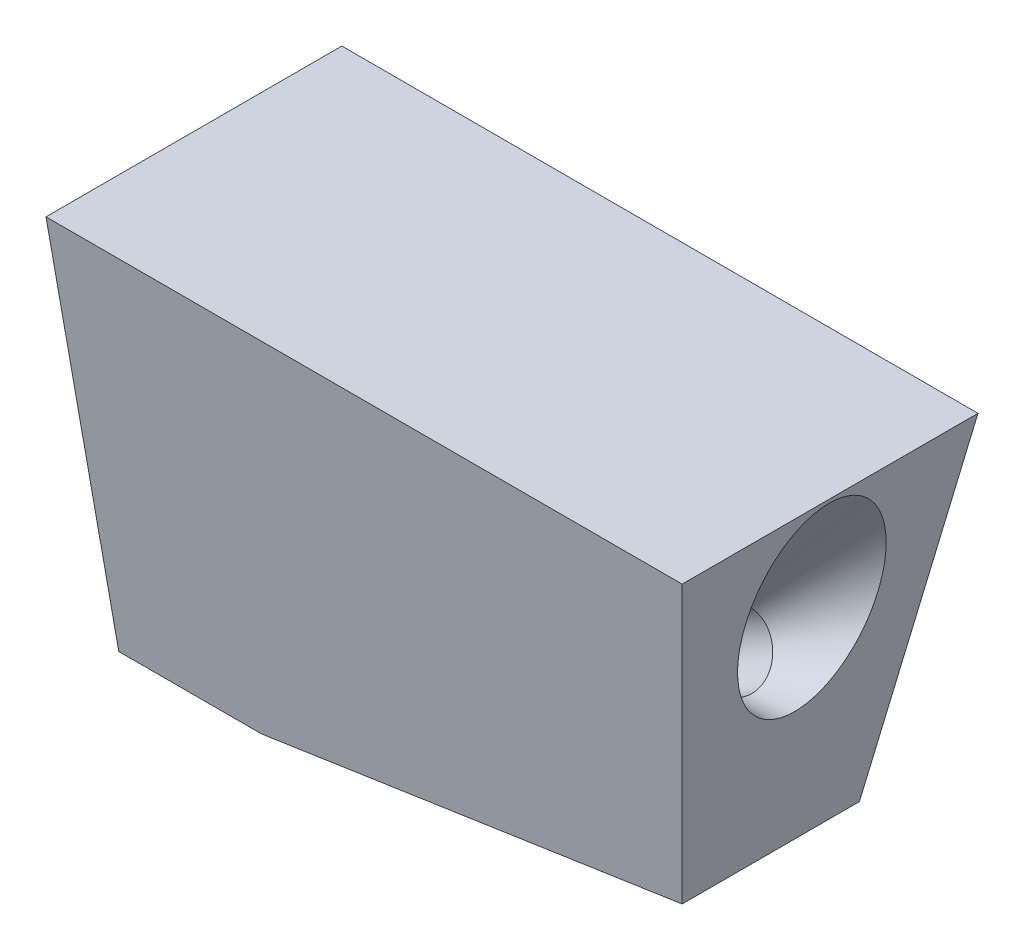
ISO-10303-21;
HEADER;
FILE_DESCRIPTION(('STEP AP214'),'2;1');
FILE_NAME('part.step','',(''),(''),'','','');
FILE_SCHEMA(('AUTOMOTIVE_DESIGN { 1 0 10303 214 1 1 1 1 }'));
ENDSEC;
DATA;
#1=APPLICATION_CONTEXT('core data for automotive mechanical design processes');
#2=APPLICATION_PROTOCOL_DEFINITION('international standard','automotive_design',2000,#1);
#3=PRODUCT_CONTEXT('',#1,'mechanical');
#4=PRODUCT('Part','Part','',(#3));
#5=PRODUCT_RELATED_PRODUCT_CATEGORY('part','',(#4));
#6=PRODUCT_DEFINITION_FORMATION('','',#4);
#7=PRODUCT_DEFINITION_CONTEXT('part definition',#1,'design');
#8=PRODUCT_DEFINITION('design','',#6,#7);
#9=PRODUCT_DEFINITION_SHAPE('','',#8);
#10=(LENGTH_UNIT() NAMED_UNIT(*) SI_UNIT(.MILLI.,.METRE.));
#11=(NAMED_UNIT(*) PLANE_ANGLE_UNIT() SI_UNIT($,.RADIAN.));
#12=(NAMED_UNIT(*) SI_UNIT($,.STERADIAN.) SOLID_ANGLE_UNIT());
#13=UNCERTAINTY_MEASURE_WITH_UNIT(LENGTH_MEASURE(1.E-05),#10,'distance_accuracy_value','');
#14=(GEOMETRIC_REPRESENTATION_CONTEXT(3) GLOBAL_UNCERTAINTY_ASSIGNED_CONTEXT((#13)) GLOBAL_UNIT_ASSIGNED_CONTEXT((#10,
#11,#12)) REPRESENTATION_CONTEXT('',''));
#15=CARTESIAN_POINT('',(0.,0.,0.));
#16=DIRECTION('',(0.,0.,1.));
#17=DIRECTION('',(1.,0.,0.));
#18=AXIS2_PLACEMENT_3D('',#15,#16,#17);
#19=CARTESIAN_POINT('',(-0.37592,0.,-0.697645113220181));
#20=DIRECTION('',(-1.,0.,0.));
#21=DIRECTION('',(0.,0.,1.));
#22=AXIS2_PLACEMENT_3D('',#19,#20,#21);
#23=PLANE('',#22);
#24=DIRECTION('',(0.,-0.984807753012208,-0.173648177666931));
#25=VECTOR('',#24,1.);
#26=CARTESIAN_POINT('',(-0.37592,-0.127991652447482,0.0282316183680482));
#27=LINE('',#26,#25);
#28=CARTESIAN_POINT('',(-0.37592,0.27922650273224,0.10003516616056));
#29=VERTEX_POINT('',#28);
#30=CARTESIAN_POINT('',(-0.375920000000002,0.,0.0508));
#31=VERTEX_POINT('',#30);
#32=EDGE_CURVE('E435',#29,#31,#27,.T.);
#33=ORIENTED_EDGE('',*,*,#32,.F.);
#34=DIRECTION('',(0.,0.,-1.));
#35=VECTOR('',#34,1.);
#36=CARTESIAN_POINT('',(-0.37592,0.27922650273224,-0.697645113220181));
#37=LINE('',#36,#35);
#38=CARTESIAN_POINT('',(-0.37592,0.27922650273224,-0.10003516616056));
#39=VERTEX_POINT('',#38);
#40=EDGE_CURVE('E61',#29,#39,#37,.T.);
#41=ORIENTED_EDGE('',*,*,#40,.T.);
#42=DIRECTION('',(0.,0.984807753012208,-0.173648177666931));
#43=VECTOR('',#42,1.);
#44=CARTESIAN_POINT('',(-0.37592,0.110617029166538,-0.0703047667678759));
#45=LINE('',#44,#43);
#46=CARTESIAN_POINT('',(-0.37592,0.,-0.0508));
#47=VERTEX_POINT('',#46);
#48=EDGE_CURVE('E169',#47,#39,#45,.T.);
#49=ORIENTED_EDGE('',*,*,#48,.F.);
#50=DIRECTION('',(0.,0.,1.));
#51=VECTOR('',#50,1.);
#52=CARTESIAN_POINT('',(-0.37592,0.,-0.697645113220181));
#53=LINE('',#52,#51);
#54=CARTESIAN_POINT('',(-0.375920000000002,0.,-0.024301429259202));
#55=VERTEX_POINT('',#54);
#56=EDGE_CURVE('E430',#47,#55,#53,.T.);
#57=ORIENTED_EDGE('',*,*,#56,.T.);
#58=CARTESIAN_POINT('',(-0.375920000000002,-0.075596242,0.));
#59=DIRECTION('',(-1.,0.,0.));
#60=DIRECTION('',(0.,0.,1.));
#61=AXIS2_PLACEMENT_3D('',#58,#59,#60);
#62=CIRCLE('',#61,0.079406242);
#63=CARTESIAN_POINT('',(-0.375920000000002,0.,0.024301429259202));
#64=VERTEX_POINT('',#63);
#65=EDGE_CURVE('E186',#55,#64,#62,.F.);
#66=ORIENTED_EDGE('',*,*,#65,.T.);
#67=EDGE_CURVE('E429',#64,#31,#53,.T.);
#68=ORIENTED_EDGE('',*,*,#67,.T.);
#69=EDGE_LOOP('',(#33,#41,#49,#57,#66,#68));
#70=FACE_BOUND('',#69,.T.);
#71=ADVANCED_FACE('F45',(#70),#23,.T.);
#72=CARTESIAN_POINT('',(38.0505893023531,0.,-0.0508));
#73=DIRECTION('',(0.,0.173648177666931,0.984807753012208));
#74=DIRECTION('',(0.,-0.984807753012208,0.173648177666931));
#75=AXIS2_PLACEMENT_3D('',#72,#73,#74);
#76=PLANE('',#75);
#77=DIRECTION('',(-1.,0.,0.));
#78=VECTOR('',#77,1.);
#79=CARTESIAN_POINT('',(38.0505893023531,0.27922650273224,-0.10003516616056));
#80=LINE('',#79,#78);
#81=CARTESIAN_POINT('',(0.0543151661605589,0.279226502732241,-0.100035166160561));
#82=VERTEX_POINT('',#81);
#83=EDGE_CURVE('E167',#82,#39,#80,.T.);
#84=ORIENTED_EDGE('',*,*,#83,.F.);
#85=DIRECTION('',(-0.171087869746036,-0.970287525247814,0.171087869746036));
#86=VECTOR('',#85,1.);
#87=CARTESIAN_POINT('',(1.11871235410314,6.31572292356323,-1.16443235410315));
#88=LINE('',#87,#86);
#89=CARTESIAN_POINT('',(0.0142086463569854,0.0517711261220263,-0.0599286463569818));
#90=VERTEX_POINT('',#89);
#91=EDGE_CURVE('E154',#82,#90,#88,.T.);
#92=ORIENTED_EDGE('',*,*,#91,.T.);
#93=DIRECTION('',(-0.984346441568213,-0.173566836012845,0.0306045161452665));
#94=VECTOR('',#93,1.);
#95=CARTESIAN_POINT('',(36.8599799943277,6.54867473978421,-1.20550804450795));
#96=LINE('',#95,#94);
#97=CARTESIAN_POINT('',(-0.279399999999989,0.,-0.0508000000000054));
#98=VERTEX_POINT('',#97);
#99=EDGE_CURVE('E164',#90,#98,#96,.T.);
#100=ORIENTED_EDGE('',*,*,#99,.T.);
#101=DIRECTION('',(-1.,0.,0.));
#102=VECTOR('',#101,1.);
#103=CARTESIAN_POINT('',(38.0505893023531,0.,-0.0508));
#104=LINE('',#103,#102);
#105=EDGE_CURVE('E163',#98,#47,#104,.T.);
#106=ORIENTED_EDGE('',*,*,#105,.T.);
#107=ORIENTED_EDGE('',*,*,#48,.T.);
#108=EDGE_LOOP('',(#84,#92,#100,#106,#107));
#109=FACE_BOUND('',#108,.T.);
#110=ADVANCED_FACE('F168',(#109),#76,.F.);
#111=CARTESIAN_POINT('',(38.0505893023531,0.,0.0508));
#112=DIRECTION('',(0.,0.173648177666931,-0.984807753012208));
#113=DIRECTION('',(0.,0.984807753012208,0.173648177666931));
#114=AXIS2_PLACEMENT_3D('',#111,#112,#113);
#115=PLANE('',#114);
#116=DIRECTION('',(1.,0.,0.));
#117=VECTOR('',#116,1.);
#118=CARTESIAN_POINT('',(38.0505893023531,0.27922650273224,0.10003516616056));
#119=LINE('',#118,#117);
#120=CARTESIAN_POINT('',(0.0543151661605588,0.279226502732241,0.100035166160561));
#121=VERTEX_POINT('',#120);
#122=EDGE_CURVE('E69',#29,#121,#119,.T.);
#123=ORIENTED_EDGE('',*,*,#122,.F.);
#124=ORIENTED_EDGE('',*,*,#32,.T.);
#125=DIRECTION('',(-1.,0.,0.));
#126=VECTOR('',#125,1.);
#127=CARTESIAN_POINT('',(38.0505893023531,0.,0.0508));
#128=LINE('',#127,#126);
#129=CARTESIAN_POINT('',(-0.279399999999989,0.,0.0507999999999916));
#130=VERTEX_POINT('',#129);
#131=EDGE_CURVE('E426',#130,#31,#128,.T.);
#132=ORIENTED_EDGE('',*,*,#131,.F.);
#133=DIRECTION('',(0.984346441568213,0.173566836012845,0.0306045161452664));
#134=VECTOR('',#133,1.);
#135=CARTESIAN_POINT('',(36.8599799943277,6.54867473978421,1.20550804450795));
#136=LINE('',#135,#134);
#137=CARTESIAN_POINT('',(0.0142086463569766,0.0517711261220234,0.0599286463569735));
#138=VERTEX_POINT('',#137);
#139=EDGE_CURVE('E411',#130,#138,#136,.T.);
#140=ORIENTED_EDGE('',*,*,#139,.T.);
#141=DIRECTION('',(0.171087869746036,0.970287525247814,0.171087869746036));
#142=VECTOR('',#141,1.);
#143=CARTESIAN_POINT('',(1.11871235410314,6.31572292356323,1.16443235410315));
#144=LINE('',#143,#142);
#145=EDGE_CURVE('E438',#138,#121,#144,.T.);
#146=ORIENTED_EDGE('',*,*,#145,.T.);
#147=EDGE_LOOP('',(#123,#124,#132,#140,#146));
#148=FACE_BOUND('',#147,.T.);
#149=ADVANCED_FACE('F341',(#148),#115,.F.);
#150=CARTESIAN_POINT('',(0.0142086463569735,0.0517711261220249,37.6441893023531));
#151=DIRECTION('',(-0.984807753012208,0.173648177666931,0.));
#152=DIRECTION('',(-0.173648177666931,-0.984807753012208,0.));
#153=AXIS2_PLACEMENT_3D('',#150,#151,#152);
#154=PLANE('',#153);
#155=CARTESIAN_POINT('',(0.042002425469776,0.209397480302932,0.));
#156=DIRECTION('',(-0.984807753012208,0.173648177666931,0.));
#157=DIRECTION('',(0.173648177666931,0.984807753012208,0.));
#158=AXIS2_PLACEMENT_3D('',#155,#156,#157);
#159=ELLIPSE('',#158,0.0679896082823363,0.0488359616240532);
#160=CARTESIAN_POINT('',(0.0538086970482922,0.27635417366364,0.));
#161=VERTEX_POINT('',#160);
#162=EDGE_CURVE('E324',#161,#161,#159,.F.);
#163=ORIENTED_EDGE('',*,*,#162,.F.);
#164=EDGE_LOOP('',(#163));
#165=FACE_BOUND('',#164,.T.);
#166=DIRECTION('',(0.,0.,-1.));
#167=VECTOR('',#166,1.);
#168=CARTESIAN_POINT('',(0.0543151661605597,0.27922650273224,37.6441893023531));
#169=LINE('',#168,#167);
#170=EDGE_CURVE('E12',#121,#82,#169,.T.);
#171=ORIENTED_EDGE('',*,*,#170,.F.);
#172=ORIENTED_EDGE('',*,*,#145,.F.);
#173=DIRECTION('',(0.,0.,-1.));
#174=VECTOR('',#173,1.);
#175=CARTESIAN_POINT('',(0.0142086463569735,0.0517711261220249,37.6441893023531));
#176=LINE('',#175,#174);
#177=EDGE_CURVE('E158',#138,#90,#176,.T.);
#178=ORIENTED_EDGE('',*,*,#177,.T.);
#179=ORIENTED_EDGE('',*,*,#91,.F.);
#180=EDGE_LOOP('',(#171,#172,#178,#179));
#181=FACE_BOUND('',#180,.T.);
#182=ADVANCED_FACE('F156',(#165,#181),#154,.F.);
#183=CARTESIAN_POINT('',(0.,0.,0.));
#184=DIRECTION('',(0.,1.,0.));
#185=DIRECTION('',(0.,0.,1.));
#186=AXIS2_PLACEMENT_3D('',#183,#184,#185);
#187=PLANE('',#186);
#188=DIRECTION('',(-1.,0.,0.));
#189=VECTOR('',#188,1.);
#190=CARTESIAN_POINT('',(37.9299393023531,0.,0.024301429259202));
#191=LINE('',#190,#189);
#192=CARTESIAN_POINT('',(-0.302505698926175,0.,0.024301429259202));
#193=VERTEX_POINT('',#192);
#194=EDGE_CURVE('E183',#193,#64,#191,.T.);
#195=ORIENTED_EDGE('',*,*,#194,.F.);
#196=CARTESIAN_POINT('',(-0.227825197505043,0.000821082384313734,0.0215810982692062));
#197=CARTESIAN_POINT('',(-0.245034827655447,0.00574587858713153,0.00414270174912001));
#198=CARTESIAN_POINT('',(-0.241524302840157,0.0282854026772107,0.0143490100953686));
#199=CARTESIAN_POINT('',(-0.232761897231027,-0.000191267152315804,0.0250702187356864));
#200=CARTESIAN_POINT('',(-0.245650855646434,0.00566777320241242,0.00770700976054411));
#201=CARTESIAN_POINT('',(-0.244977713848214,0.026157616484449,0.0166688839114718));
#202=CARTESIAN_POINT('',(-0.238431185756585,-0.00123806953368211,0.027930289615228));
#203=CARTESIAN_POINT('',(-0.248388192218129,0.00497262893043278,0.0115103437863978));
#204=CARTESIAN_POINT('',(-0.248913969918457,0.0238423713748454,0.0185705102982331));
#205=CARTESIAN_POINT('',(-0.250793194721189,-0.00297707742583745,0.0322289362925408));
#206=CARTESIAN_POINT('',(-0.255892273738704,0.00341525099514985,0.0177455655134612));
#207=CARTESIAN_POINT('',(-0.257357955889735,0.0193962809886868,0.0214286282586706));
#208=CARTESIAN_POINT('',(-0.257506274585809,-0.00366066852221202,0.0336336714025015));
#209=CARTESIAN_POINT('',(-0.260633657709613,0.00254190370459321,0.0203534609740121));
#210=CARTESIAN_POINT('',(-0.261876654974955,0.0172708330905814,0.0223626195700815));
#211=CARTESIAN_POINT('',(-0.269799835115366,-0.00410994322563168,0.0345696750414885));
#212=CARTESIAN_POINT('',(-0.269751315759274,0.00149116630553639,0.0230126072141926));
#213=CARTESIAN_POINT('',(-0.269946288127882,0.0142679037069781,0.0229849570200847));
#214=CARTESIAN_POINT('',(-0.275323446491675,-0.00403774105700813,0.0344314054213974));
#215=CARTESIAN_POINT('',(-0.274027420527515,0.00118322418916697,0.0235670913464913));
#216=CARTESIAN_POINT('',(-0.273501911955909,0.0132223642176632,0.0228930232292358));
#217=CARTESIAN_POINT('',(-0.286011306031935,-0.00322845548345473,0.0327000352877498));
#218=CARTESIAN_POINT('',(-0.282179914978438,0.00109125813693063,0.0231161412096964));
#219=CARTESIAN_POINT('',(-0.280210477091128,0.0119412986892854,0.0217418562581842));
#220=CARTESIAN_POINT('',(-0.291173148744714,-0.00248730685306159,0.0310980388902579));
#221=CARTESIAN_POINT('',(-0.286149097631656,0.00129894419664579,0.0221276357619358));
#222=CARTESIAN_POINT('',(-0.283360821575895,0.0117107676757025,0.0206767083128105));
#223=CARTESIAN_POINT('',(-0.299602822393734,-0.000801539704433188,0.0267477659134277));
#224=CARTESIAN_POINT('',(-0.292408755866523,0.00191881633869061,0.0190819593298142));
#225=CARTESIAN_POINT('',(-0.288383902424835,0.0118611241504694,0.0177842646529243));
#226=CARTESIAN_POINT('',(-0.303030538955303,0.000103444682686011,0.0241781701007463));
#227=CARTESIAN_POINT('',(-0.294889447090707,0.0023037022246217,0.0171668741087767));
#228=CARTESIAN_POINT('',(-0.290370237180289,0.0121655112151282,0.0160757716097415));
#229=CARTESIAN_POINT('',(-0.308514392850169,0.00172652459697053,0.0183135948687384));
#230=CARTESIAN_POINT('',(-0.298746447297998,0.00298044372071625,0.012879858933677));
#231=CARTESIAN_POINT('',(-0.293503241996811,0.0128466727594801,0.0121764867744927));
#232=CARTESIAN_POINT('',(-0.310606869220775,0.00244921520093865,0.0150414006438955));
#233=CARTESIAN_POINT('',(-0.300152350128904,0.00327523254656574,0.0105128092522198));
#234=CARTESIAN_POINT('',(-0.294672249601443,0.0132211344266295,0.010000844581469));
#235=CARTESIAN_POINT('',(-0.312967619974572,0.00329568497416077,0.00931742185770279));
#236=CARTESIAN_POINT('',(-0.301716686246427,0.00361214202736292,0.00646467066227568));
#237=CARTESIAN_POINT('',(-0.295983169510553,0.013678095082922,0.0061950406152292));
#238=CARTESIAN_POINT('',(-0.313617084874504,0.00354030598861865,0.00697552549228586));
#239=CARTESIAN_POINT('',(-0.302136666185862,0.00370603321499294,0.00483113633064015));
#240=CARTESIAN_POINT('',(-0.29634080920666,0.0138168290783898,0.00463794216868613));
#241=CARTESIAN_POINT('',(-0.314563628458891,0.00389545139863984,0.000787930489150023));
#242=CARTESIAN_POINT('',(-0.302752910089274,0.00384367854693773,0.000535544065680751));
#243=CARTESIAN_POINT('',(-0.296862391385962,0.0140175043608145,0.000523885411308966));
#244=CARTESIAN_POINT('',(-0.314417113795285,0.00383807612208008,-0.00311886327876337));
#245=CARTESIAN_POINT('',(-0.302660770954939,0.00382288355677158,-0.00213939502445816));
#246=CARTESIAN_POINT('',(-0.296782271000047,0.013983779546503,-0.0020736943094739));
#247=CARTESIAN_POINT('',(-0.312657905792592,0.00318275039907247,-0.0106634982811221));
#248=CARTESIAN_POINT('',(-0.301511531396563,0.00356664435177186,-0.00740601427595318));
#249=CARTESIAN_POINT('',(-0.295811667919384,0.0136160577081122,-0.007090030478481));
#250=CARTESIAN_POINT('',(-0.311045007020005,0.0025847242100467,-0.0143013017540773));
#251=CARTESIAN_POINT('',(-0.300461562154091,0.00333278827930966,-0.00998164829714308));
#252=CARTESIAN_POINT('',(-0.294921071680773,0.0132820186114908,-0.00950876181954922));
#253=CARTESIAN_POINT('',(-0.306440159650584,0.00108938252153803,-0.020880290888427));
#254=CARTESIAN_POINT('',(-0.29729910359028,0.00271570653149375,-0.0147410667047117));
#255=CARTESIAN_POINT('',(-0.292324145606441,0.0125632939646946,-0.0138830517805381));
#256=CARTESIAN_POINT('',(-0.30345573705115,0.000193707650167118,-0.0238251473132877));
#257=CARTESIAN_POINT('',(-0.295199673901025,0.00233432378586256,-0.0169294269223584));
#258=CARTESIAN_POINT('',(-0.290622265671655,0.0121788928930591,-0.0158410510464991));
#259=CARTESIAN_POINT('',(-0.296432365420741,-0.00148605921301844,-0.028628143513798));
#260=CARTESIAN_POINT('',(-0.290078907132247,0.00166019233881121,-0.0204132760605369));
#261=CARTESIAN_POINT('',(-0.286507609386632,0.0117486224899564,-0.0190345048786184));
#262=CARTESIAN_POINT('',(-0.292421815697956,-0.00227239044141986,-0.0305117439313388));
#263=CARTESIAN_POINT('',(-0.287063238453745,0.00136248817850754,-0.0217461800460033));
#264=CARTESIAN_POINT('',(-0.284113782114589,0.0116944848100444,-0.0202868879163018));
#265=CARTESIAN_POINT('',(-0.283849340075187,-0.00342900818647396,-0.0331572963874476));
#266=CARTESIAN_POINT('',(-0.280569772361123,0.0010856610224745,-0.0233043318321131));
#267=CARTESIAN_POINT('',(-0.278862882478683,0.0121596022092071,-0.0220458836090603));
#268=CARTESIAN_POINT('',(-0.279295190972908,-0.00380452880153439,-0.0339333987496222));
#269=CARTESIAN_POINT('',(-0.277047639383919,0.00110327745740793,-0.023545154910523));
#270=CARTESIAN_POINT('',(-0.276012181647064,0.0126714724574782,-0.0225619046424186));
#271=CARTESIAN_POINT('',(-0.269701463152515,-0.00410629730163296,-0.0345630378480585));
#272=CARTESIAN_POINT('',(-0.269746394801657,0.00148426748942568,-0.0229936986933425));
#273=CARTESIAN_POINT('',(-0.269881702633036,0.0142919892466934,-0.0229805440307946));
#274=CARTESIAN_POINT('',(-0.264653504068372,-0.00399168402953402,-0.0343326317027686));
#275=CARTESIAN_POINT('',(-0.2659129984888,0.00189006473089505,-0.0220765629153878));
#276=CARTESIAN_POINT('',(-0.266586044859265,0.0154476236056216,-0.0228273497835158));
#277=CARTESIAN_POINT('',(-0.253793893841115,-0.00329673403971204,-0.0328464784638622));
#278=CARTESIAN_POINT('',(-0.25804777168414,0.00299938327773119,-0.0189984846186303));
#279=CARTESIAN_POINT('',(-0.259381389799495,0.0184306001459407,-0.0218392245471482));
#280=CARTESIAN_POINT('',(-0.248036924026835,-0.00262603076696128,-0.0313908642611835));
#281=CARTESIAN_POINT('',(-0.25412124898949,0.00376990506999124,-0.0165248798583642));
#282=CARTESIAN_POINT('',(-0.255484648351846,0.0203469392501991,-0.0208714043450132));
#283=CARTESIAN_POINT('',(-0.239413210970669,-0.00134157330358348,-0.028165632697237));
#284=CARTESIAN_POINT('',(-0.249253851903819,0.00480639473717398,-0.0119576174475555));
#285=CARTESIAN_POINT('',(-0.24957588621242,0.0235275660937497,-0.0187269870547679));
#286=CARTESIAN_POINT('',(-0.236308205853108,-0.000811429626366428,-0.0267516692029636));
#287=CARTESIAN_POINT('',(-0.24771983337294,0.0051601389311344,-0.0100184273300864));
#288=CARTESIAN_POINT('',(-0.247431093294174,0.0247477519269788,-0.0177868599027238));
#289=CARTESIAN_POINT('',(-0.230477145019733,0.000272654770886545,-0.0234963613029371));
#290=CARTESIAN_POINT('',(-0.245473970538167,0.00567015630017144,-0.00606795690835905));
#291=CARTESIAN_POINT('',(-0.243380619980735,0.0271372754227797,-0.0156224452219534));
#292=CARTESIAN_POINT('',(-0.227751727404986,0.000826633560826962,-0.0216543108103016));
#293=CARTESIAN_POINT('',(-0.244812549085203,0.00581424778672661,-0.00404223108031309));
#294=CARTESIAN_POINT('',(-0.241475342731792,0.0283065252460894,-0.0143976882246357));
#295=CARTESIAN_POINT('',(-0.225275643428538,0.00135586198968455,-0.0195888989002276));
#296=CARTESIAN_POINT('',(-0.244757355961534,0.00576877420614223,-0.00225342325622203));
#297=CARTESIAN_POINT('',(-0.239737733013406,0.0293975411594971,-0.0130244209340158));
#298=(BOUNDED_SURFACE() B_SPLINE_SURFACE(3,2,((#196,#197,#198),(#199,#200,#201),(#202,#203,
#204),(#205,#206,#207),(#208,#209,#210),(#211,#212,#213),(#214,#215,#216),(#217,#218,#219),
(#220,#221,#222),(#223,#224,#225),(#226,#227,#228),(#229,#230,#231),(#232,#233,#234),(#235,#236,
#237),(#238,#239,#240),(#241,#242,#243),(#244,#245,#246),(#247,#248,#249),(#250,#251,#252),
(#253,#254,#255),(#256,#257,#258),(#259,#260,#261),(#262,#263,#264),(#265,#266,#267),(#268,#269,
#270),(#271,#272,#273),(#274,#275,#276),(#277,#278,#279),(#280,#281,#282),(#283,#284,#285),
(#286,#287,#288),(#289,#290,#291),(#292,#293,#294),(#295,#296,#297)),.UNSPECIFIED.,.F.,.F.,
.F.) B_SPLINE_SURFACE_WITH_KNOTS((4,2,2,2,2,2,2,2,2,2,2,2,2,2,2,2,4),(3,3),(0.,
0.0201539584671881,0.0407666975654291,0.0570670854146052,0.0734672035679023,0.0877081664327257,
0.101542859946109,0.110571495241634,0.125004171594238,0.139438870208372,0.153795289694016,
0.167790761380671,0.181605763093261,0.19659395858546,0.214644351189683,0.225509394554146,
0.236392487536961),(0.,1.),
.UNSPECIFIED.) GEOMETRIC_REPRESENTATION_ITEM() RATIONAL_B_SPLINE_SURFACE(((1.,0.630877932053694,
1.),(1.,0.672074069199554,1.),(1.,0.710262779390349,1.),(1.,0.777863435183107,1.),(1.,
0.807055799266452,1.),(1.,0.847025625113269,1.),(1.,0.860377941141275,1.),(1.,0.877904377756496,
1.),(1.,0.882021843771012,1.),(1.,0.883303214852003,1.),(1.,0.881311221974648,1.),(1.,
0.876025044633842,1.),(1.,0.872769630583407,1.),(1.,0.868698546182562,1.),(1.,0.867428195714935,
1.),(1.,0.86559550462401,1.),(1.,0.865912049725688,1.),(1.,0.869253613703966,1.),(1.,
0.872279012077236,1.),(1.,0.878303632729241,1.),(1.,0.881302907987323,1.),(1.,0.883414326053349,
1.),(1.,0.88262230290473,1.),(1.,0.874779530792039,1.),(1.,0.867809619062972,1.),(1.,
0.846482034914803,1.),(1.,0.831547246020609,1.),(1.,0.791082953057688,1.),(1.,0.764012271614353,
1.),(1.,0.714444681703178,1.),(1.,0.694416731867675,1.),(1.,0.652735964736715,1.),(1.,
0.631080503393025,1.),(1.,0.60923796740264,1.))) REPRESENTATION_ITEM('') SURFACE());
#299=CARTESIAN_POINT('',(-0.302505698926173,0.,0.0243014292591998));
#300=CARTESIAN_POINT('',(-0.301189653751042,0.,0.0243303034984779));
#301=CARTESIAN_POINT('',(-0.299893265882524,0.,0.0244879989132688));
#302=CARTESIAN_POINT('',(-0.297321845085298,0.,0.0249318934199553));
#303=CARTESIAN_POINT('',(-0.296046791417956,0.,0.0252179591691541));
#304=CARTESIAN_POINT('',(-0.29223043850594,0.,0.0260743698526111));
#305=CARTESIAN_POINT('',(-0.28969025145603,0.,0.0266446536985803));
#306=CARTESIAN_POINT('',(-0.284577115121523,0.,0.0276215558975383));
#307=CARTESIAN_POINT('',(-0.282004128745236,0.,0.0280279681026352));
#308=CARTESIAN_POINT('',(-0.27939999999899,0.,0.0282696689974253));
#309=B_SPLINE_CURVE_WITH_KNOTS('',3,(#299,#300,#301,#302,#303,#304,#305,#306,#307,#308),
.UNSPECIFIED.,.F.,.F.,(4,2,2,2,4),(0.,0.00392016575312297,0.00783626888681539,
0.0156448592896654,0.0234632423546317),.UNSPECIFIED.);
#310=CARTESIAN_POINT('',(-0.2794,0.,0.0282696690019624));
#311=VERTEX_POINT('',#310);
#312=EDGE_CURVE('E322',#193,#311,#309,.T.);
#313=ORIENTED_EDGE('',*,*,#312,.T.);
#314=DIRECTION('',(0.,0.,-1.));
#315=VECTOR('',#314,1.);
#316=CARTESIAN_POINT('',(-0.2794,0.,37.6441893023531));
#317=LINE('',#316,#315);
#318=EDGE_CURVE('E405',#130,#311,#317,.T.);
#319=ORIENTED_EDGE('',*,*,#318,.F.);
#320=ORIENTED_EDGE('',*,*,#131,.T.);
#321=ORIENTED_EDGE('',*,*,#67,.F.);
#322=EDGE_LOOP('',(#195,#313,#319,#320,#321));
#323=FACE_BOUND('',#322,.T.);
#324=ADVANCED_FACE('F337',(#323),#187,.F.);
#325=CARTESIAN_POINT('',(-0.22414416739421,0.09398,0.));
#326=DIRECTION('',(-0.499999999999998,-0.86602540378444,0.));
#327=DIRECTION('',(0.86602540378444,-0.499999999999998,0.));
#328=AXIS2_PLACEMENT_3D('',#325,#326,#327);
#329=CYLINDRICAL_SURFACE('',#328,0.02286);
#330=DIRECTION('',(-0.499999999999998,-0.86602540378444,0.));
#331=VECTOR('',#330,1.);
#332=CARTESIAN_POINT('',(-0.208802659269489,0.120552271536748,0.02286));
#333=LINE('',#332,#331);
#334=CARTESIAN_POINT('',(-0.22414416739421,0.09398,0.02286));
#335=VERTEX_POINT('',#334);
#336=CARTESIAN_POINT('',(-0.270149117557675,0.0142970889172039,0.02286));
#337=VERTEX_POINT('',#336);
#338=EDGE_CURVE('E383',#335,#337,#333,.T.);
#339=ORIENTED_EDGE('',*,*,#338,.T.);
#340=CARTESIAN_POINT('',(-0.241524302840157,0.0282854026772107,0.0143490100953686));
#341=CARTESIAN_POINT('',(-0.244977713848214,0.026157616484449,0.0166688839114718));
#342=CARTESIAN_POINT('',(-0.248913969918457,0.0238423713748454,0.0185705102982331));
#343=CARTESIAN_POINT('',(-0.257357955889735,0.0193962809886868,0.0214286282586705));
#344=CARTESIAN_POINT('',(-0.261876654974955,0.0172708330905814,0.0223626195700815));
#345=CARTESIAN_POINT('',(-0.269946288127882,0.0142679037069781,0.0229849570200847));
#346=CARTESIAN_POINT('',(-0.273501911955909,0.0132223642176632,0.0228930232292358));
#347=CARTESIAN_POINT('',(-0.280210477091128,0.0119412986892854,0.0217418562581842));
#348=CARTESIAN_POINT('',(-0.283360821575895,0.0117107676757025,0.0206767083128105));
#349=CARTESIAN_POINT('',(-0.288383902424835,0.0118611241504694,0.0177842646529243));
#350=CARTESIAN_POINT('',(-0.290370237180289,0.0121655112151282,0.0160757716097415));
#351=CARTESIAN_POINT('',(-0.293503241996811,0.0128466727594801,0.0121764867744927));
#352=CARTESIAN_POINT('',(-0.294672249601443,0.0132211344266295,0.010000844581469));
#353=CARTESIAN_POINT('',(-0.295983169510553,0.013678095082922,0.0061950406152292));
#354=CARTESIAN_POINT('',(-0.29634080920666,0.0138168290783898,0.00463794216868613));
#355=CARTESIAN_POINT('',(-0.296862391385962,0.0140175043608145,0.000523885411308965));
#356=CARTESIAN_POINT('',(-0.296782271000047,0.013983779546503,-0.0020736943094739));
#357=CARTESIAN_POINT('',(-0.295811667919384,0.0136160577081122,-0.007090030478481));
#358=CARTESIAN_POINT('',(-0.294921071680773,0.0132820186114908,-0.00950876181954922));
#359=CARTESIAN_POINT('',(-0.292324145606441,0.0125632939646946,-0.0138830517805381));
#360=CARTESIAN_POINT('',(-0.290622265671655,0.0121788928930591,-0.0158410510464991));
#361=CARTESIAN_POINT('',(-0.286507609386632,0.0117486224899564,-0.0190345048786184));
#362=CARTESIAN_POINT('',(-0.284113782114589,0.0116944848100444,-0.0202868879163018));
#363=CARTESIAN_POINT('',(-0.278862882478683,0.0121596022092071,-0.0220458836090603));
#364=CARTESIAN_POINT('',(-0.276012181647063,0.0126714724574782,-0.0225619046424186));
#365=CARTESIAN_POINT('',(-0.269881702633036,0.0142919892466934,-0.0229805440307946));
#366=CARTESIAN_POINT('',(-0.266586044859265,0.0154476236056216,-0.0228273497835158));
#367=CARTESIAN_POINT('',(-0.259381389799495,0.0184306001459407,-0.0218392245471482));
#368=CARTESIAN_POINT('',(-0.255484648351846,0.0203469392501991,-0.0208714043450132));
#369=CARTESIAN_POINT('',(-0.24957588621242,0.0235275660937497,-0.0187269870547679));
#370=CARTESIAN_POINT('',(-0.247431093294174,0.0247477519269788,-0.0177868599027238));
#371=CARTESIAN_POINT('',(-0.243380619980735,0.0271372754227797,-0.0156224452219534));
#372=CARTESIAN_POINT('',(-0.241475342731792,0.0283065252460894,-0.0143976882246358));
#373=CARTESIAN_POINT('',(-0.239737733013406,0.0293975411594971,-0.0130244209340158));
#374=B_SPLINE_CURVE_WITH_KNOTS('',3,(#340,#341,#342,#343,#344,#345,#346,#347,#348,#349,#350,
#351,#352,#353,#354,#355,#356,#357,#358,#359,#360,#361,#362,#363,#364,#365,#366,#367,#368,#369,
#370,#371,#372,#373),.UNSPECIFIED.,.F.,.F.,(4,2,2,2,2,2,2,2,2,2,2,2,2,2,2,2,4),(0.,
0.0201539584671881,0.0407666975654291,0.0570670854146052,0.0734672035679023,0.0877081664327257,
0.101542859946109,0.110571495241634,0.125004171594238,0.139438870208372,0.153795289694016,
0.167790761380671,0.181605763093261,0.19659395858546,0.214644351189683,0.225509394554146,
0.236392487536961),.UNSPECIFIED.);
#375=CARTESIAN_POINT('',(-0.270149117557506,0.0142970889174967,-0.02286));
#376=VERTEX_POINT('',#375);
#377=EDGE_CURVE('E279',#337,#376,#374,.T.);
#378=ORIENTED_EDGE('',*,*,#377,.T.);
#379=DIRECTION('',(0.499999999999998,0.86602540378444,0.));
#380=VECTOR('',#379,1.);
#381=CARTESIAN_POINT('',(-0.22414416739421,0.09398,-0.02286));
#382=LINE('',#381,#380);
#383=CARTESIAN_POINT('',(-0.22414416739421,0.09398,-0.02286));
#384=VERTEX_POINT('',#383);
#385=EDGE_CURVE('E381',#376,#384,#382,.T.);
#386=ORIENTED_EDGE('',*,*,#385,.T.);
#387=CARTESIAN_POINT('',(-0.22414416739421,0.09398,0.));
#388=DIRECTION('',(0.,-1.,0.));
#389=DIRECTION('',(-1.,0.,0.));
#390=AXIS2_PLACEMENT_3D('',#387,#388,#389);
#391=ELLIPSE('',#390,0.0263964543073497,0.02286);
#392=EDGE_CURVE('E389',#384,#335,#391,.F.);
#393=ORIENTED_EDGE('',*,*,#392,.T.);
#394=EDGE_LOOP('',(#339,#378,#386,#393));
#395=FACE_BOUND('',#394,.T.);
#396=ADVANCED_FACE('F229',(#395),#329,.F.);
#397=CARTESIAN_POINT('',(0.,0.,0.02286));
#398=DIRECTION('',(0.,0.,-1.));
#399=DIRECTION('',(-1.,0.,0.));
#400=AXIS2_PLACEMENT_3D('',#397,#398,#399);
#401=PLANE('',#400);
#402=DIRECTION('',(-0.984807753012208,-0.173648177666931,0.));
#403=VECTOR('',#402,1.);
#404=CARTESIAN_POINT('',(-0.2794,0.,0.0228599999999995));
#405=LINE('',#404,#403);
#406=CARTESIAN_POINT('',(-0.1143,0.0291115845149677,0.0228599999999998));
#407=VERTEX_POINT('',#406);
#408=CARTESIAN_POINT('',(-0.252368938397868,0.00476630547764848,0.0228599999999995));
#409=VERTEX_POINT('',#408);
#410=EDGE_CURVE('E323',#407,#409,#405,.T.);
#411=ORIENTED_EDGE('',*,*,#410,.T.);
#412=CARTESIAN_POINT('',(-0.252368938397868,0.00476630547764848,0.0228599999999995));
#413=CARTESIAN_POINT('',(-0.258415752421945,0.00697972986525133,0.0228599999992844));
#414=CARTESIAN_POINT('',(-0.264012984747342,0.00991787427757624,0.0228599999992846));
#415=CARTESIAN_POINT('',(-0.269491992306078,0.0138165191920229,0.022860000000046));
#416=CARTESIAN_POINT('',(-0.269821486367798,0.0140553025928321,0.0228600000000951));
#417=CARTESIAN_POINT('',(-0.270149117559222,0.0142970889170507,0.022860000000147));
#418=B_SPLINE_CURVE_WITH_KNOTS('',3,(#412,#413,#414,#415,#416,#417),.UNSPECIFIED.,.F.,.F.,(4,2,
4),(0.,0.0189645806868845,0.0201853405497978),.UNSPECIFIED.);
#419=EDGE_CURVE('E364',#409,#337,#418,.T.);
#420=ORIENTED_EDGE('',*,*,#419,.T.);
#421=ORIENTED_EDGE('',*,*,#338,.F.);
#422=DIRECTION('',(-1.,0.,0.));
#423=VECTOR('',#422,1.);
#424=CARTESIAN_POINT('',(-0.25054062170156,0.09398,0.02286));
#425=LINE('',#424,#423);
#426=CARTESIAN_POINT('',(-0.121701865104678,0.09398,0.02286));
#427=VERTEX_POINT('',#426);
#428=EDGE_CURVE('E198',#427,#335,#425,.T.);
#429=ORIENTED_EDGE('',*,*,#428,.F.);
#430=CARTESIAN_POINT('',(-0.1143,0.09398,0.02286));
#431=VERTEX_POINT('',#430);
#432=EDGE_CURVE('E193',#431,#427,#425,.T.);
#433=ORIENTED_EDGE('',*,*,#432,.F.);
#434=DIRECTION('',(0.,1.,0.));
#435=VECTOR('',#434,1.);
#436=CARTESIAN_POINT('',(-0.1143,0.09398,0.02286));
#437=LINE('',#436,#435);
#438=EDGE_CURVE('E197',#407,#431,#437,.T.);
#439=ORIENTED_EDGE('',*,*,#438,.F.);
#440=EDGE_LOOP('',(#411,#420,#421,#429,#433,#439));
#441=FACE_BOUND('',#440,.T.);
#442=ADVANCED_FACE('F265',(#441),#401,.T.);
#443=CARTESIAN_POINT('',(0.,0.,-0.02286));
#444=DIRECTION('',(0.,0.,-1.));
#445=DIRECTION('',(-1.,0.,0.));
#446=AXIS2_PLACEMENT_3D('',#443,#444,#445);
#447=PLANE('',#446);
#448=ORIENTED_EDGE('',*,*,#385,.F.);
#449=CARTESIAN_POINT('',(-0.252368938397868,0.00476630547764848,-0.0228599999999995));
#450=CARTESIAN_POINT('',(-0.258415752425477,0.00697972985975805,-0.0228599999999964));
#451=CARTESIAN_POINT('',(-0.264012984750581,0.00991787427187431,-0.0228599999999965));
#452=CARTESIAN_POINT('',(-0.269491992304944,0.0138165191917322,-0.0228600000000002));
#453=CARTESIAN_POINT('',(-0.269821486366396,0.0140553025928986,-0.0228600000000005));
#454=CARTESIAN_POINT('',(-0.270149117557534,0.0142970889174966,-0.0228600000000007));
#455=B_SPLINE_CURVE_WITH_KNOTS('',3,(#449,#450,#451,#452,#453,#454),.UNSPECIFIED.,.F.,.F.,(4,2,
4),(0.,0.0189645806858143,0.0201853405487022),.UNSPECIFIED.);
#456=CARTESIAN_POINT('',(-0.252368938397868,0.00476630547764848,-0.0228599999999995));
#457=VERTEX_POINT('',#456);
#458=EDGE_CURVE('E270',#376,#457,#455,.F.);
#459=ORIENTED_EDGE('',*,*,#458,.T.);
#460=DIRECTION('',(-0.984807753012208,-0.173648177666931,0.));
#461=VECTOR('',#460,1.);
#462=CARTESIAN_POINT('',(-0.2794,0.,-0.0228599999999995));
#463=LINE('',#462,#461);
#464=CARTESIAN_POINT('',(-0.1143,0.0291115845149677,-0.0228599999999998));
#465=VERTEX_POINT('',#464);
#466=EDGE_CURVE('E441',#465,#457,#463,.T.);
#467=ORIENTED_EDGE('',*,*,#466,.F.);
#468=DIRECTION('',(0.,1.,0.));
#469=VECTOR('',#468,1.);
#470=CARTESIAN_POINT('',(-0.1143,0.09398,-0.02286));
#471=LINE('',#470,#469);
#472=CARTESIAN_POINT('',(-0.1143,0.09398,-0.02286));
#473=VERTEX_POINT('',#472);
#474=EDGE_CURVE('E206',#465,#473,#471,.T.);
#475=ORIENTED_EDGE('',*,*,#474,.T.);
#476=DIRECTION('',(-1.,0.,0.));
#477=VECTOR('',#476,1.);
#478=CARTESIAN_POINT('',(-0.25054062170156,0.09398,-0.02286));
#479=LINE('',#478,#477);
#480=CARTESIAN_POINT('',(-0.121701865104678,0.09398,-0.02286));
#481=VERTEX_POINT('',#480);
#482=EDGE_CURVE('E202',#473,#481,#479,.T.);
#483=ORIENTED_EDGE('',*,*,#482,.T.);
#484=EDGE_CURVE('E192',#481,#384,#479,.T.);
#485=ORIENTED_EDGE('',*,*,#484,.T.);
#486=EDGE_LOOP('',(#448,#459,#467,#475,#483,#485));
#487=FACE_BOUND('',#486,.T.);
#488=ADVANCED_FACE('F260',(#487),#447,.F.);
#489=CARTESIAN_POINT('',(-0.2794,0.,-0.0282696689971954));
#490=VERTEX_POINT('',#489);
#491=EDGE_CURVE('E413',#490,#98,#317,.T.);
#492=ORIENTED_EDGE('',*,*,#491,.F.);
#493=CARTESIAN_POINT('',(-0.2794,0.,-0.0282696689971954));
#494=CARTESIAN_POINT('',(-0.281345639865883,0.,-0.0280696594245745));
#495=CARTESIAN_POINT('',(-0.283281501702588,0.,-0.02780042612144));
#496=CARTESIAN_POINT('',(-0.287134331719711,0.,-0.0271519507510644));
#497=CARTESIAN_POINT('',(-0.28905130588931,0.,-0.0267727447977257));
#498=CARTESIAN_POINT('',(-0.29286940485298,0.,-0.0259323507371869));
#499=CARTESIAN_POINT('',(-0.294770519807286,0.,-0.0254711151977177));
#500=CARTESIAN_POINT('',(-0.298604012110879,0.,-0.0247067414256691));
#501=CARTESIAN_POINT('',(-0.300536434586142,0.,-0.0244038571584293));
#502=CARTESIAN_POINT('',(-0.302505698926471,0.,-0.0243014292605922));
#503=B_SPLINE_CURVE_WITH_KNOTS('',3,(#493,#494,#495,#496,#497,#498,#499,#500,#501,#502),
.UNSPECIFIED.,.F.,.F.,(4,2,2,2,4),(0.,0.00586218927175541,0.0117224556356863,0.0175861216860616,
0.0234591633143403),.UNSPECIFIED.);
#504=CARTESIAN_POINT('',(-0.302505698926168,0.,-0.024301429259202));
#505=VERTEX_POINT('',#504);
#506=EDGE_CURVE('E54',#490,#505,#503,.T.);
#507=ORIENTED_EDGE('',*,*,#506,.T.);
#508=DIRECTION('',(-1.,0.,0.));
#509=VECTOR('',#508,1.);
#510=CARTESIAN_POINT('',(37.9299393023531,0.,-0.024301429259202));
#511=LINE('',#510,#509);
#512=EDGE_CURVE('E182',#505,#55,#511,.T.);
#513=ORIENTED_EDGE('',*,*,#512,.T.);
#514=ORIENTED_EDGE('',*,*,#56,.F.);
#515=ORIENTED_EDGE('',*,*,#105,.F.);
#516=EDGE_LOOP('',(#492,#507,#513,#514,#515));
#517=FACE_BOUND('',#516,.T.);
#518=ADVANCED_FACE('F264',(#517),#187,.F.);
#519=CARTESIAN_POINT('',(-0.2794,0.,37.6441893023531));
#520=DIRECTION('',(-0.173648177666931,0.984807753012208,0.));
#521=DIRECTION('',(-0.984807753012208,-0.173648177666931,0.));
#522=AXIS2_PLACEMENT_3D('',#519,#520,#521);
#523=PLANE('',#522);
#524=ORIENTED_EDGE('',*,*,#318,.T.);
#525=CARTESIAN_POINT('',(-0.2794,0.,0.0282696690019624));
#526=CARTESIAN_POINT('',(-0.277101916049036,0.000405214204488122,0.0280923466665852));
#527=CARTESIAN_POINT('',(-0.2748044063397,0.000810327154683731,0.0278760969313052));
#528=CARTESIAN_POINT('',(-0.270236412604504,0.00161578769790594,0.0273216535708309));
#529=CARTESIAN_POINT('',(-0.267965849944408,0.00201614915627007,0.0269841093686439));
#530=CARTESIAN_POINT('',(-0.263445529910706,0.00281320353964878,0.0261406608312347));
#531=CARTESIAN_POINT('',(-0.261195867696364,0.00320987968551762,0.0256341963691301));
#532=CARTESIAN_POINT('',(-0.25673982038036,0.00399560105464263,0.0244132569404285));
#533=CARTESIAN_POINT('',(-0.254533728407908,0.0043845945913103,0.0236976920320141));
#534=CARTESIAN_POINT('',(-0.252368938397874,0.00476630547764754,0.0228599999999337));
#535=B_SPLINE_CURVE_WITH_KNOTS('',3,(#525,#526,#527,#528,#529,#530,#531,#532,#533,#534),
.UNSPECIFIED.,.F.,.F.,(4,2,2,2,4),(0.,0.00702402798464455,0.014010995643945,0.0210213657970611,
0.028068950164899),.UNSPECIFIED.);
#536=EDGE_CURVE('E358',#311,#409,#535,.T.);
#537=ORIENTED_EDGE('',*,*,#536,.T.);
#538=ORIENTED_EDGE('',*,*,#410,.F.);
#539=DIRECTION('',(0.,0.,1.));
#540=VECTOR('',#539,1.);
#541=CARTESIAN_POINT('',(-0.1143,0.0291115845149677,37.6441893023531));
#542=LINE('',#541,#540);
#543=EDGE_CURVE('E444',#465,#407,#542,.T.);
#544=ORIENTED_EDGE('',*,*,#543,.F.);
#545=ORIENTED_EDGE('',*,*,#466,.T.);
#546=CARTESIAN_POINT('',(-0.252368938397868,0.00476630547764848,-0.0228599999999995));
#547=CARTESIAN_POINT('',(-0.254537663852282,0.00438390066628612,-0.023681403105721));
#548=CARTESIAN_POINT('',(-0.256743881540719,0.00399488496249847,-0.0243958827105832));
#549=CARTESIAN_POINT('',(-0.261197686968956,0.00320955889867445,-0.0256241755760291));
#550=CARTESIAN_POINT('',(-0.263444995943899,0.00281329769240361,-0.026139024925466));
#551=CARTESIAN_POINT('',(-0.26796369130148,0.00201652978326,-0.0269882241933047));
#552=CARTESIAN_POINT('',(-0.270234982349493,0.00161603989045366,-0.027323124498599));
#553=CARTESIAN_POINT('',(-0.274804397856214,0.000810328650551127,-0.0278731378768206));
#554=CARTESIAN_POINT('',(-0.277102600831084,0.000405093458937113,-0.0280876020716085));
#555=CARTESIAN_POINT('',(-0.279399999999987,0.,-0.0282696689972323));
#556=B_SPLINE_CURVE_WITH_KNOTS('',3,(#546,#547,#548,#549,#550,#551,#552,#553,#554,#555),
.UNSPECIFIED.,.F.,.F.,(4,2,2,2,4),(0.,0.00704620905524321,0.0140553422162622,0.0210429136223459,
0.0280677796525705),.UNSPECIFIED.);
#557=EDGE_CURVE('E352',#457,#490,#556,.T.);
#558=ORIENTED_EDGE('',*,*,#557,.T.);
#559=ORIENTED_EDGE('',*,*,#491,.T.);
#560=ORIENTED_EDGE('',*,*,#99,.F.);
#561=ORIENTED_EDGE('',*,*,#177,.F.);
#562=ORIENTED_EDGE('',*,*,#139,.F.);
#563=EDGE_LOOP('',(#524,#537,#538,#544,#545,#558,#559,#560,#561,#562));
#564=FACE_BOUND('',#563,.T.);
#565=ADVANCED_FACE('F335',(#564),#523,.F.);
#566=CARTESIAN_POINT('',(-0.0100451207555483,0.158445051406807,0.));
#567=DIRECTION('',(0.866025403784438,0.500000000000001,0.));
#568=DIRECTION('',(-0.500000000000001,0.866025403784438,0.));
#569=AXIS2_PLACEMENT_3D('',#566,#567,#568);
#570=CONICAL_SURFACE('',#569,0.02286,0.392699081698725);
#571=CARTESIAN_POINT('',(-0.0100451207555483,0.158445051406807,0.));
#572=DIRECTION('',(0.866025403784438,0.500000000000001,0.));
#573=DIRECTION('',(0.,0.,1.));
#574=AXIS2_PLACEMENT_3D('',#571,#572,#573);
#575=ELLIPSE('',#574,0.02286,0.02286);
#576=CARTESIAN_POINT('',(-0.0100451207555483,0.158445051406807,0.02286));
#577=VERTEX_POINT('',#576);
#578=EDGE_CURVE('E213',#577,#577,#575,.T.);
#579=ORIENTED_EDGE('',*,*,#578,.F.);
#580=EDGE_LOOP('',(#579));
#581=FACE_BOUND('',#580,.T.);
#582=ORIENTED_EDGE('',*,*,#162,.T.);
#583=EDGE_LOOP('',(#582));
#584=FACE_BOUND('',#583,.T.);
#585=ADVANCED_FACE('F258',(#581,#584),#570,.F.);
#586=CARTESIAN_POINT('',(-0.1143,0.09398,0.02286));
#587=DIRECTION('',(-1.,0.,0.));
#588=DIRECTION('',(0.,-1.,0.));
#589=AXIS2_PLACEMENT_3D('',#586,#587,#588);
#590=PLANE('',#589);
#591=ORIENTED_EDGE('',*,*,#543,.T.);
#592=ORIENTED_EDGE('',*,*,#438,.T.);
#593=DIRECTION('',(0.,0.,-1.));
#594=VECTOR('',#593,1.);
#595=CARTESIAN_POINT('',(-0.1143,0.09398,0.02286));
#596=LINE('',#595,#594);
#597=CARTESIAN_POINT('',(-0.1143,0.09398,0.022558428541082));
#598=VERTEX_POINT('',#597);
#599=EDGE_CURVE('E209',#431,#598,#596,.T.);
#600=ORIENTED_EDGE('',*,*,#599,.T.);
#601=CARTESIAN_POINT('',(-0.1143,0.09398,-0.022558428541082));
#602=CARTESIAN_POINT('',(-0.1143,0.0924057954271396,-0.0223350739677228));
#603=CARTESIAN_POINT('',(-0.1143,0.0908473961619637,-0.0219863559476948));
#604=CARTESIAN_POINT('',(-0.114300000000001,0.0878232222853705,-0.021045236197347));
#605=CARTESIAN_POINT('',(-0.114300000000001,0.0863566862966872,-0.0204552694923748));
#606=CARTESIAN_POINT('',(-0.114300000000003,0.0836314249981602,-0.0190781339672697));
#607=CARTESIAN_POINT('',(-0.114300000000004,0.0823654563397034,-0.0183054228404669));
#608=CARTESIAN_POINT('',(-0.114300000000005,0.0800644708531108,-0.0166144135763873));
#609=CARTESIAN_POINT('',(-0.114300000000006,0.0790196002447956,-0.0157096007323188));
#610=CARTESIAN_POINT('',(-0.114300000000006,0.0771643066063933,-0.0138008393322429));
#611=CARTESIAN_POINT('',(-0.114300000000006,0.0763428139930791,-0.0128077169978791));
#612=CARTESIAN_POINT('',(-0.114300000000004,0.0749251370212176,-0.010759196998839));
#613=CARTESIAN_POINT('',(-0.114300000000003,0.0743183458374455,-0.0097111768156276));
#614=CARTESIAN_POINT('',(-0.114300000000003,0.0733162877692488,-0.00757886119497436));
#615=CARTESIAN_POINT('',(-0.114300000000005,0.0729122756447162,-0.00649871279172247));
#616=CARTESIAN_POINT('',(-0.114299999999998,0.0723015502545453,-0.00432171232043561));
#617=CARTESIAN_POINT('',(-0.114299999999989,0.072088997019209,-0.00322647101600367));
#618=CARTESIAN_POINT('',(-0.114300000000025,0.071734449991773,9.16613753542644E-05));
#619=CARTESIAN_POINT('',(-0.114300000000133,0.0718734966375593,0.00235139313016695));
#620=CARTESIAN_POINT('',(-0.114300000000133,0.0728855112869597,0.00670026012496271));
#621=CARTESIAN_POINT('',(-0.114300000000026,0.0737604387248659,0.00878892354970379));
#622=CARTESIAN_POINT('',(-0.114299999999987,0.0755276760867997,0.0116838043538415));
#623=CARTESIAN_POINT('',(-0.114299999999997,0.0762114568813561,0.0126255424063949));
#624=CARTESIAN_POINT('',(-0.114300000000004,0.0777109772225134,0.014397382104886));
#625=CARTESIAN_POINT('',(-0.114300000000001,0.0785266707441539,0.015227522503429));
#626=CARTESIAN_POINT('',(-0.114299999999999,0.0804881791803639,0.0169617907888546));
#627=CARTESIAN_POINT('',(-0.1143,0.0816651228791231,0.0178307580552436));
#628=CARTESIAN_POINT('',(-0.114300000000001,0.0841423892079517,0.0193643673135986));
#629=CARTESIAN_POINT('',(-0.114300000000001,0.0854426525558248,0.0200291068368617));
#630=CARTESIAN_POINT('',(-0.1143,0.0890845383164814,0.0215500056510078));
#631=CARTESIAN_POINT('',(-0.114299999999999,0.0915112965445996,0.0222081322560808));
#632=CARTESIAN_POINT('',(-0.1143,0.0939800000000006,0.0225584285410807));
#633=B_SPLINE_CURVE_WITH_KNOTS('',3,(#601,#602,#603,#604,#605,#606,#607,#608,#609,#610,#611,
#612,#613,#614,#615,#616,#617,#618,#619,#620,#621,#622,#623,#624,#625,#626,#627,#628,#629,#630,
#631,#632),.UNSPECIFIED.,.F.,.F.,(4,2,2,2,2,2,2,2,2,2,2,2,2,2,2,4),(0.,0.00476809197059755,
0.00948920096910113,0.0139182417437814,0.0180458893931116,0.021894696898086,0.0255111846663137,
0.0289543140677515,0.0322884650381485,0.0389428027453572,0.0456149152989206,0.0490953100649423,
0.0525744931146836,0.0569413412001942,0.0613061005940968,0.068763133809714),.UNSPECIFIED.);
#634=CARTESIAN_POINT('',(-0.1143,0.09398,-0.0225584285410835));
#635=VERTEX_POINT('',#634);
#636=EDGE_CURVE('E234',#635,#598,#633,.T.);
#637=ORIENTED_EDGE('',*,*,#636,.F.);
#638=EDGE_CURVE('E201',#635,#473,#596,.T.);
#639=ORIENTED_EDGE('',*,*,#638,.T.);
#640=ORIENTED_EDGE('',*,*,#474,.F.);
#641=EDGE_LOOP('',(#591,#592,#600,#637,#639,#640));
#642=FACE_BOUND('',#641,.T.);
#643=ADVANCED_FACE('F224',(#642),#590,.T.);
#644=CARTESIAN_POINT('',(-0.368473003280035,-0.0484933830537734,0.));
#645=DIRECTION('',(0.866025403784438,0.500000000000001,0.));
#646=DIRECTION('',(0.,0.,1.));
#647=AXIS2_PLACEMENT_3D('',#644,#645,#646);
#648=ELLIPSE('',#647,0.02286,0.02286);
#649=DIRECTION('',(0.866025403784438,0.500000000000001,0.));
#650=VECTOR('',#649,1.);
#651=SURFACE_OF_LINEAR_EXTRUSION('',#648,#650);
#652=ORIENTED_EDGE('',*,*,#636,.T.);
#653=CARTESIAN_POINT('',(-0.1143,0.09398,0.022558428541082));
#654=CARTESIAN_POINT('',(-0.116200605452524,0.0939800000053368,0.0227137940856093));
#655=CARTESIAN_POINT('',(-0.118105116103306,0.0939800000035386,0.0228090003395157));
#656=CARTESIAN_POINT('',(-0.121916334658613,0.0939799999964614,0.0228797121210303));
#657=CARTESIAN_POINT('',(-0.123823042526682,0.0939799999911823,0.0228552196069251));
#658=CARTESIAN_POINT('',(-0.129544354331629,0.0939799999863009,0.0226028510355693));
#659=CARTESIAN_POINT('',(-0.133353906355921,0.0939799999977075,0.0221955802386929));
#660=CARTESIAN_POINT('',(-0.13899138352998,0.0939800000010646,0.0211856744613189));
#661=CARTESIAN_POINT('',(-0.140856425360032,0.0939799999998972,0.0207829703104003));
#662=CARTESIAN_POINT('',(-0.144548298003053,0.0939800000000826,0.0198285741670676));
#663=CARTESIAN_POINT('',(-0.14637512007677,0.0939800000014359,0.0192768484923401));
#664=CARTESIAN_POINT('',(-0.15054039092353,0.0939799999978668,0.0177982953823792));
#665=CARTESIAN_POINT('',(-0.152858384328396,0.0939799999908295,0.0168080409398351));
#666=CARTESIAN_POINT('',(-0.156712996653393,0.093979999983444,0.0147506354747019));
#667=CARTESIAN_POINT('',(-0.15829710558093,0.0939799999818399,0.0137689688181238));
#668=CARTESIAN_POINT('',(-0.162001383395592,0.0939799999964925,0.0109807856518751));
#669=CARTESIAN_POINT('',(-0.164018588776523,0.0939800000215987,0.00900397375603319));
#670=CARTESIAN_POINT('',(-0.166189362933785,0.0939799999887847,0.00542065898289917));
#671=CARTESIAN_POINT('',(-0.166772651945666,0.0939799999649811,0.00409312099753641));
#672=CARTESIAN_POINT('',(-0.167433567716761,0.0939799999648852,0.00129620907290427));
#673=CARTESIAN_POINT('',(-0.167508069491358,0.0939799999888852,-0.000173985257840079));
#674=CARTESIAN_POINT('',(-0.167130030129446,0.0939800000063539,-0.00289213322202226));
#675=CARTESIAN_POINT('',(-0.166727314067407,0.093980000002528,-0.00414788249804033));
#676=CARTESIAN_POINT('',(-0.165351699043243,0.0939799999963386,-0.0070232448484405));
#677=CARTESIAN_POINT('',(-0.164204129745173,0.0939799999953992,-0.00855363436764992));
#678=CARTESIAN_POINT('',(-0.160748677189967,0.0939799999965922,-0.0121541381917286));
#679=CARTESIAN_POINT('',(-0.158169203505441,0.0939800000010883,-0.0139384214002358));
#680=CARTESIAN_POINT('',(-0.15290716168426,0.0939799999989837,-0.0168098215395047));
#681=CARTESIAN_POINT('',(-0.150242677005867,0.0939799999930968,-0.0179352238537781));
#682=CARTESIAN_POINT('',(-0.144788498225534,0.0939799999925047,-0.0198003051989951));
#683=CARTESIAN_POINT('',(-0.141999066041202,0.093979999997777,-0.0205407535337742));
#684=CARTESIAN_POINT('',(-0.136360515577058,0.0939800000017682,-0.0217066194759313));
#685=CARTESIAN_POINT('',(-0.133511440656961,0.0939800000004917,-0.0221322582917158));
#686=CARTESIAN_POINT('',(-0.12794465546934,0.0939799999995325,-0.02268796286045));
#687=CARTESIAN_POINT('',(-0.125228418850691,0.0939799999997654,-0.0228331064139891));
#688=CARTESIAN_POINT('',(-0.119771381559813,0.0939800000002365,-0.0228799235570446));
#689=CARTESIAN_POINT('',(-0.117030562719806,0.0939800000004747,-0.022779583364952));
#690=CARTESIAN_POINT('',(-0.1143,0.09398,-0.0225584285410806));
#691=B_SPLINE_CURVE_WITH_KNOTS('',3,(#653,#654,#655,#656,#657,#658,#659,#660,#661,#662,#663,
#664,#665,#666,#667,#668,#669,#670,#671,#672,#673,#674,#675,#676,#677,#678,#679,#680,#681,#682,
#683,#684,#685,#686,#687,#688,#689,#690),.UNSPECIFIED.,.F.,.F.,(4,2,2,2,2,2,2,2,2,2,2,2,2,2,2,2,
2,2,4),(0.,0.0057178944747409,0.0114356954043293,0.0228899607132278,0.0286089045870761,
0.0343291421578373,0.0418543936152889,0.0474415923081785,0.0556837331764767,0.0599628774376098,
0.0642682808636108,0.068161074547967,0.0737988652867793,0.0830622926770272,0.0917134356191602,
0.10034722274392,0.108974937353762,0.117124349850535,0.125340838403206),.UNSPECIFIED.);
#692=EDGE_CURVE('E240',#598,#427,#691,.T.);
#693=ORIENTED_EDGE('',*,*,#692,.T.);
#694=EDGE_CURVE('E247',#427,#481,#691,.T.);
#695=ORIENTED_EDGE('',*,*,#694,.T.);
#696=EDGE_CURVE('E248',#481,#635,#691,.T.);
#697=ORIENTED_EDGE('',*,*,#696,.T.);
#698=EDGE_LOOP('',(#652,#693,#695,#697));
#699=FACE_BOUND('',#698,.T.);
#700=ORIENTED_EDGE('',*,*,#578,.T.);
#701=EDGE_LOOP('',(#700));
#702=FACE_BOUND('',#701,.T.);
#703=ADVANCED_FACE('F218',(#699,#702),#651,.F.);
#704=CARTESIAN_POINT('',(-0.25054062170156,0.09398,0.02286));
#705=DIRECTION('',(0.,-1.,0.));
#706=DIRECTION('',(0.,0.,-1.));
#707=AXIS2_PLACEMENT_3D('',#704,#705,#706);
#708=PLANE('',#707);
#709=ORIENTED_EDGE('',*,*,#599,.F.);
#710=ORIENTED_EDGE('',*,*,#432,.T.);
#711=ORIENTED_EDGE('',*,*,#692,.F.);
#712=EDGE_LOOP('',(#709,#710,#711));
#713=FACE_BOUND('',#712,.T.);
#714=ADVANCED_FACE('F223',(#713),#708,.T.);
#715=ORIENTED_EDGE('',*,*,#484,.F.);
#716=ORIENTED_EDGE('',*,*,#694,.F.);
#717=ORIENTED_EDGE('',*,*,#428,.T.);
#718=ORIENTED_EDGE('',*,*,#392,.F.);
#719=EDGE_LOOP('',(#715,#716,#717,#718));
#720=FACE_BOUND('',#719,.T.);
#721=ADVANCED_FACE('F253',(#720),#708,.T.);
#722=ORIENTED_EDGE('',*,*,#482,.F.);
#723=ORIENTED_EDGE('',*,*,#638,.F.);
#724=ORIENTED_EDGE('',*,*,#696,.F.);
#725=EDGE_LOOP('',(#722,#723,#724));
#726=FACE_BOUND('',#725,.T.);
#727=ADVANCED_FACE('F255',(#726),#708,.T.);
#728=CARTESIAN_POINT('',(37.9299393023531,-0.075596242,0.));
#729=DIRECTION('',(-1.,0.,0.));
#730=DIRECTION('',(0.,0.,1.));
#731=AXIS2_PLACEMENT_3D('',#728,#729,#730);
#732=CYLINDRICAL_SURFACE('',#731,0.079406242);
#733=ORIENTED_EDGE('',*,*,#512,.F.);
#734=CARTESIAN_POINT('',(-0.225275643428538,0.00135586198968455,-0.0195888989002276));
#735=CARTESIAN_POINT('',(-0.227751727404986,0.000826633560826961,-0.0216543108103016));
#736=CARTESIAN_POINT('',(-0.230477145019733,0.000272654770886544,-0.0234963613029371));
#737=CARTESIAN_POINT('',(-0.236308205853108,-0.000811429626366428,-0.0267516692029636));
#738=CARTESIAN_POINT('',(-0.239413210970669,-0.00134157330358348,-0.028165632697237));
#739=CARTESIAN_POINT('',(-0.248036924026835,-0.00262603076696128,-0.0313908642611835));
#740=CARTESIAN_POINT('',(-0.253793893841115,-0.00329673403971204,-0.0328464784638622));
#741=CARTESIAN_POINT('',(-0.264653504068372,-0.00399168402953402,-0.0343326317027686));
#742=CARTESIAN_POINT('',(-0.269701463152515,-0.00410629730163296,-0.0345630378480585));
#743=CARTESIAN_POINT('',(-0.279295190972908,-0.00380452880153439,-0.0339333987496222));
#744=CARTESIAN_POINT('',(-0.283849340075187,-0.00342900818647396,-0.0331572963874476));
#745=CARTESIAN_POINT('',(-0.292421815697956,-0.00227239044141986,-0.0305117439313388));
#746=CARTESIAN_POINT('',(-0.296432365420741,-0.00148605921301844,-0.028628143513798));
#747=CARTESIAN_POINT('',(-0.30345573705115,0.000193707650167119,-0.0238251473132877));
#748=CARTESIAN_POINT('',(-0.306440159650584,0.00108938252153803,-0.020880290888427));
#749=CARTESIAN_POINT('',(-0.311045007020005,0.0025847242100467,-0.0143013017540773));
#750=CARTESIAN_POINT('',(-0.312657905792592,0.00318275039907247,-0.010663498281122));
#751=CARTESIAN_POINT('',(-0.314417113795285,0.00383807612208008,-0.00311886327876337));
#752=CARTESIAN_POINT('',(-0.314563628458891,0.00389545139863985,0.000787930489150014));
#753=CARTESIAN_POINT('',(-0.313617084874504,0.00354030598861865,0.00697552549228586));
#754=CARTESIAN_POINT('',(-0.312967619974572,0.00329568497416077,0.00931742185770279));
#755=CARTESIAN_POINT('',(-0.310606869220775,0.00244921520093865,0.0150414006438955));
#756=CARTESIAN_POINT('',(-0.308514392850169,0.00172652459697053,0.0183135948687384));
#757=CARTESIAN_POINT('',(-0.303030538955303,0.000103444682686011,0.0241781701007463));
#758=CARTESIAN_POINT('',(-0.299602822393734,-0.000801539704433188,0.0267477659134277));
#759=CARTESIAN_POINT('',(-0.291173148744714,-0.00248730685306159,0.0310980388902579));
#760=CARTESIAN_POINT('',(-0.286011306031935,-0.00322845548345473,0.0327000352877498));
#761=CARTESIAN_POINT('',(-0.275323446491675,-0.00403774105700812,0.0344314054213974));
#762=CARTESIAN_POINT('',(-0.269799835115366,-0.00410994322563168,0.0345696750414885));
#763=CARTESIAN_POINT('',(-0.257506274585809,-0.00366066852221202,0.0336336714025015));
#764=CARTESIAN_POINT('',(-0.250793194721189,-0.00297707742583745,0.0322289362925408));
#765=CARTESIAN_POINT('',(-0.238431185756585,-0.00123806953368211,0.027930289615228));
#766=CARTESIAN_POINT('',(-0.232761897231026,-0.000191267152315801,0.0250702187356864));
#767=CARTESIAN_POINT('',(-0.227825197505043,0.000821082384313734,0.0215810982692062));
#768=B_SPLINE_CURVE_WITH_KNOTS('',3,(#734,#735,#736,#737,#738,#739,#740,#741,#742,#743,#744,
#745,#746,#747,#748,#749,#750,#751,#752,#753,#754,#755,#756,#757,#758,#759,#760,#761,#762,#763,
#764,#765,#766,#767),.UNSPECIFIED.,.F.,.F.,(4,2,2,2,2,2,2,2,2,2,2,2,2,2,2,2,4),(0.,
0.0108830929828149,0.0217481363472783,0.0397985289515007,0.0547867244436997,0.0686017261562903,
0.0825971978429453,0.096953617328589,0.111388315942723,0.125820992295327,0.134849627590852,
0.148684321104235,0.162925283969059,0.179325402122356,0.195625789971532,0.216238529069773,
0.236392487536961),.UNSPECIFIED.);
#769=EDGE_CURVE('E313',#505,#193,#768,.T.);
#770=ORIENTED_EDGE('',*,*,#769,.T.);
#771=ORIENTED_EDGE('',*,*,#194,.T.);
#772=ORIENTED_EDGE('',*,*,#65,.F.);
#773=EDGE_LOOP('',(#733,#770,#771,#772));
#774=FACE_BOUND('',#773,.T.);
#775=ADVANCED_FACE('F295',(#774),#732,.F.);
#776=ORIENTED_EDGE('',*,*,#458,.F.);
#777=ORIENTED_EDGE('',*,*,#377,.F.);
#778=ORIENTED_EDGE('',*,*,#419,.F.);
#779=ORIENTED_EDGE('',*,*,#536,.F.);
#780=ORIENTED_EDGE('',*,*,#312,.F.);
#781=ORIENTED_EDGE('',*,*,#769,.F.);
#782=ORIENTED_EDGE('',*,*,#506,.F.);
#783=ORIENTED_EDGE('',*,*,#557,.F.);
#784=EDGE_LOOP('',(#776,#777,#778,#779,#780,#781,#782,#783));
#785=FACE_BOUND('',#784,.T.);
#786=ADVANCED_FACE('F291',(#785),#298,.T.);
#787=CARTESIAN_POINT('',(0.,0.27922650273224,0.));
#788=DIRECTION('',(0.,1.,0.));
#789=DIRECTION('',(0.,0.,1.));
#790=AXIS2_PLACEMENT_3D('',#787,#788,#789);
#791=PLANE('',#790);
#792=ORIENTED_EDGE('',*,*,#40,.F.);
#793=ORIENTED_EDGE('',*,*,#122,.T.);
#794=ORIENTED_EDGE('',*,*,#170,.T.);
#795=ORIENTED_EDGE('',*,*,#83,.T.);
#796=EDGE_LOOP('',(#792,#793,#794,#795));
#797=FACE_BOUND('',#796,.T.);
#798=ADVANCED_FACE('F173',(#797),#791,.T.);
#799=CLOSED_SHELL('',(#71,#110,#149,#182,#324,#396,#442,#488,#518,#565,#585,#643,#703,#714,#721,
#727,#775,#786,#798));
#800=MANIFOLD_SOLID_BREP('B2',#799);
#801=ADVANCED_BREP_SHAPE_REPRESENTATION('',(#18,#800),#14);
#802=SHAPE_DEFINITION_REPRESENTATION(#9,#801);
ENDSEC;
END-ISO-10303-21;
